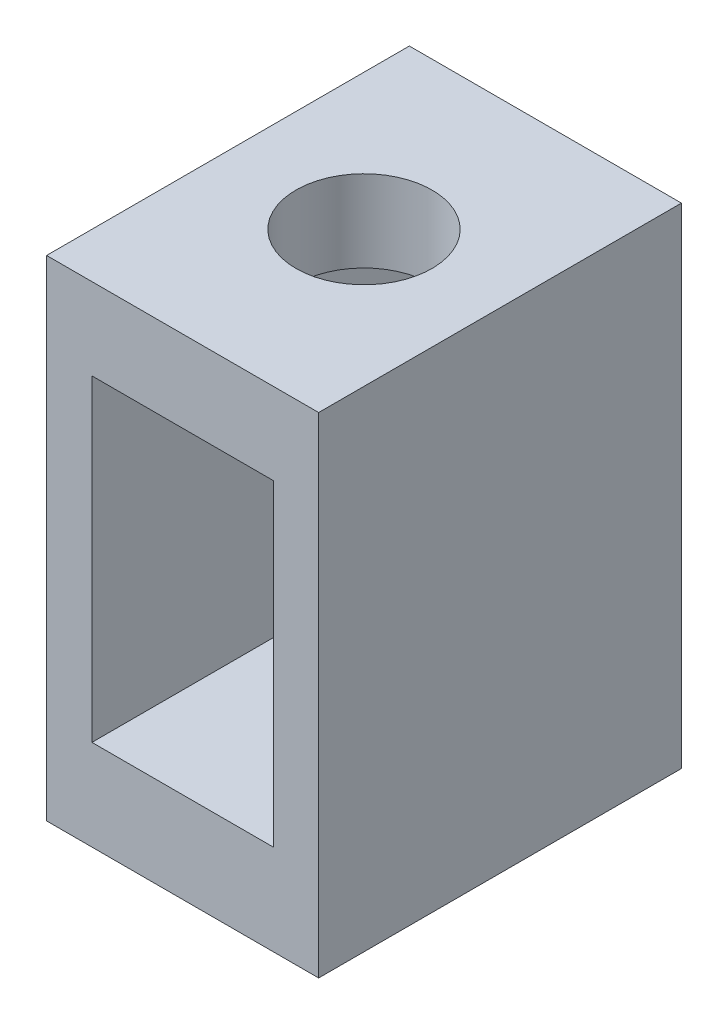
ISO-10303-21;
HEADER;
FILE_DESCRIPTION(('STEP AP214'),'2;1');
FILE_NAME('part.step','',(''),(''),'','','');
FILE_SCHEMA(('AUTOMOTIVE_DESIGN { 1 0 10303 214 1 1 1 1 }'));
ENDSEC;
DATA;
#1=APPLICATION_CONTEXT('core data for automotive mechanical design processes');
#2=APPLICATION_PROTOCOL_DEFINITION('international standard','automotive_design',2000,#1);
#3=PRODUCT_CONTEXT('',#1,'mechanical');
#4=PRODUCT('Part','Part','',(#3));
#5=PRODUCT_RELATED_PRODUCT_CATEGORY('part','',(#4));
#6=PRODUCT_DEFINITION_FORMATION('','',#4);
#7=PRODUCT_DEFINITION_CONTEXT('part definition',#1,'design');
#8=PRODUCT_DEFINITION('design','',#6,#7);
#9=PRODUCT_DEFINITION_SHAPE('','',#8);
#10=(LENGTH_UNIT() NAMED_UNIT(*) SI_UNIT(.MILLI.,.METRE.));
#11=(NAMED_UNIT(*) PLANE_ANGLE_UNIT() SI_UNIT($,.RADIAN.));
#12=(NAMED_UNIT(*) SI_UNIT($,.STERADIAN.) SOLID_ANGLE_UNIT());
#13=UNCERTAINTY_MEASURE_WITH_UNIT(LENGTH_MEASURE(1.E-05),#10,'distance_accuracy_value','');
#14=(GEOMETRIC_REPRESENTATION_CONTEXT(3) GLOBAL_UNCERTAINTY_ASSIGNED_CONTEXT((#13)) GLOBAL_UNIT_ASSIGNED_CONTEXT((#10,
#11,#12)) REPRESENTATION_CONTEXT('',''));
#15=CARTESIAN_POINT('',(0.,0.,0.));
#16=DIRECTION('',(0.,0.,1.));
#17=DIRECTION('',(1.,0.,0.));
#18=AXIS2_PLACEMENT_3D('',#15,#16,#17);
#19=CARTESIAN_POINT('',(1.5,2.7,-4.));
#20=DIRECTION('',(1.,0.,0.));
#21=DIRECTION('',(0.,1.,0.));
#22=AXIS2_PLACEMENT_3D('',#19,#20,#21);
#23=PLANE('',#22);
#24=DIRECTION('',(0.,1.,0.));
#25=VECTOR('',#24,1.);
#26=CARTESIAN_POINT('',(1.5,2.7,0.));
#27=LINE('',#26,#25);
#28=CARTESIAN_POINT('',(1.5,-2.7,0.));
#29=VERTEX_POINT('',#28);
#30=CARTESIAN_POINT('',(1.5,2.7,0.));
#31=VERTEX_POINT('',#30);
#32=EDGE_CURVE('E136',#29,#31,#27,.T.);
#33=ORIENTED_EDGE('',*,*,#32,.F.);
#34=DIRECTION('',(0.,0.,1.));
#35=VECTOR('',#34,1.);
#36=CARTESIAN_POINT('',(1.5,-2.7,-4.));
#37=LINE('',#36,#35);
#38=CARTESIAN_POINT('',(1.5,-2.7,-4.));
#39=VERTEX_POINT('',#38);
#40=EDGE_CURVE('E11',#39,#29,#37,.T.);
#41=ORIENTED_EDGE('',*,*,#40,.F.);
#42=DIRECTION('',(0.,1.,0.));
#43=VECTOR('',#42,1.);
#44=CARTESIAN_POINT('',(1.5,2.7,-4.));
#45=LINE('',#44,#43);
#46=CARTESIAN_POINT('',(1.5,2.7,-4.));
#47=VERTEX_POINT('',#46);
#48=EDGE_CURVE('E140',#39,#47,#45,.T.);
#49=ORIENTED_EDGE('',*,*,#48,.T.);
#50=DIRECTION('',(0.,0.,1.));
#51=VECTOR('',#50,1.);
#52=CARTESIAN_POINT('',(1.5,2.7,-4.));
#53=LINE('',#52,#51);
#54=EDGE_CURVE('E38',#47,#31,#53,.T.);
#55=ORIENTED_EDGE('',*,*,#54,.T.);
#56=EDGE_LOOP('',(#33,#41,#49,#55));
#57=FACE_BOUND('',#56,.T.);
#58=ADVANCED_FACE('F35',(#57),#23,.T.);
#59=CARTESIAN_POINT('',(-1.5,-2.7,-4.));
#60=DIRECTION('',(0.,-1.,0.));
#61=DIRECTION('',(0.,0.,-1.));
#62=AXIS2_PLACEMENT_3D('',#59,#60,#61);
#63=PLANE('',#62);
#64=DIRECTION('',(1.,0.,0.));
#65=VECTOR('',#64,1.);
#66=CARTESIAN_POINT('',(-1.5,-2.7,0.));
#67=LINE('',#66,#65);
#68=CARTESIAN_POINT('',(-1.5,-2.7,0.));
#69=VERTEX_POINT('',#68);
#70=EDGE_CURVE('E144',#69,#29,#67,.T.);
#71=ORIENTED_EDGE('',*,*,#70,.F.);
#72=DIRECTION('',(0.,0.,1.));
#73=VECTOR('',#72,1.);
#74=CARTESIAN_POINT('',(-1.5,-2.7,-4.));
#75=LINE('',#74,#73);
#76=CARTESIAN_POINT('',(-1.5,-2.7,-4.));
#77=VERTEX_POINT('',#76);
#78=EDGE_CURVE('E43',#77,#69,#75,.T.);
#79=ORIENTED_EDGE('',*,*,#78,.F.);
#80=DIRECTION('',(1.,0.,0.));
#81=VECTOR('',#80,1.);
#82=CARTESIAN_POINT('',(-1.5,-2.7,-4.));
#83=LINE('',#82,#81);
#84=EDGE_CURVE('E150',#77,#39,#83,.T.);
#85=ORIENTED_EDGE('',*,*,#84,.T.);
#86=ORIENTED_EDGE('',*,*,#40,.T.);
#87=EDGE_LOOP('',(#71,#79,#85,#86));
#88=FACE_BOUND('',#87,.T.);
#89=ADVANCED_FACE('F176',(#88),#63,.T.);
#90=CARTESIAN_POINT('',(-1.5,2.7,-4.));
#91=DIRECTION('',(-1.,0.,0.));
#92=DIRECTION('',(0.,-1.,0.));
#93=AXIS2_PLACEMENT_3D('',#90,#91,#92);
#94=PLANE('',#93);
#95=DIRECTION('',(0.,-1.,0.));
#96=VECTOR('',#95,1.);
#97=CARTESIAN_POINT('',(-1.5,2.7,0.));
#98=LINE('',#97,#96);
#99=CARTESIAN_POINT('',(-1.5,2.7,0.));
#100=VERTEX_POINT('',#99);
#101=EDGE_CURVE('E158',#100,#69,#98,.T.);
#102=ORIENTED_EDGE('',*,*,#101,.F.);
#103=DIRECTION('',(0.,0.,1.));
#104=VECTOR('',#103,1.);
#105=CARTESIAN_POINT('',(-1.5,2.7,-4.));
#106=LINE('',#105,#104);
#107=CARTESIAN_POINT('',(-1.5,2.7,-4.));
#108=VERTEX_POINT('',#107);
#109=EDGE_CURVE('E163',#108,#100,#106,.T.);
#110=ORIENTED_EDGE('',*,*,#109,.F.);
#111=DIRECTION('',(0.,-1.,0.));
#112=VECTOR('',#111,1.);
#113=CARTESIAN_POINT('',(-1.5,2.7,-4.));
#114=LINE('',#113,#112);
#115=EDGE_CURVE('E147',#108,#77,#114,.T.);
#116=ORIENTED_EDGE('',*,*,#115,.T.);
#117=ORIENTED_EDGE('',*,*,#78,.T.);
#118=EDGE_LOOP('',(#102,#110,#116,#117));
#119=FACE_BOUND('',#118,.T.);
#120=ADVANCED_FACE('F180',(#119),#94,.T.);
#121=CARTESIAN_POINT('',(-1.5,2.7,-4.));
#122=DIRECTION('',(0.,1.,0.));
#123=DIRECTION('',(0.,0.,1.));
#124=AXIS2_PLACEMENT_3D('',#121,#122,#123);
#125=PLANE('',#124);
#126=CARTESIAN_POINT('',(0.,2.7,-2.));
#127=DIRECTION('',(0.,1.,0.));
#128=DIRECTION('',(0.,0.,1.));
#129=AXIS2_PLACEMENT_3D('',#126,#127,#128);
#130=CIRCLE('',#129,0.75);
#131=CARTESIAN_POINT('',(0.,2.7,-1.25));
#132=VERTEX_POINT('',#131);
#133=EDGE_CURVE('E275',#132,#132,#130,.T.);
#134=ORIENTED_EDGE('',*,*,#133,.F.);
#135=EDGE_LOOP('',(#134));
#136=FACE_BOUND('',#135,.T.);
#137=DIRECTION('',(-1.,0.,0.));
#138=VECTOR('',#137,1.);
#139=CARTESIAN_POINT('',(-1.5,2.7,0.));
#140=LINE('',#139,#138);
#141=EDGE_CURVE('E155',#31,#100,#140,.T.);
#142=ORIENTED_EDGE('',*,*,#141,.F.);
#143=ORIENTED_EDGE('',*,*,#54,.F.);
#144=DIRECTION('',(-1.,0.,0.));
#145=VECTOR('',#144,1.);
#146=CARTESIAN_POINT('',(-1.5,2.7,-4.));
#147=LINE('',#146,#145);
#148=EDGE_CURVE('E143',#47,#108,#147,.T.);
#149=ORIENTED_EDGE('',*,*,#148,.T.);
#150=ORIENTED_EDGE('',*,*,#109,.T.);
#151=EDGE_LOOP('',(#142,#143,#149,#150));
#152=FACE_BOUND('',#151,.T.);
#153=ADVANCED_FACE('F171',(#136,#152),#125,.T.);
#154=CARTESIAN_POINT('',(0.,0.,-4.));
#155=DIRECTION('',(0.,0.,1.));
#156=DIRECTION('',(1.,0.,0.));
#157=AXIS2_PLACEMENT_3D('',#154,#155,#156);
#158=PLANE('',#157);
#159=DIRECTION('',(-1.,0.,0.));
#160=VECTOR('',#159,1.);
#161=CARTESIAN_POINT('',(-1.,1.8,-4.));
#162=LINE('',#161,#160);
#163=CARTESIAN_POINT('',(0.999999999999999,1.8,-4.));
#164=VERTEX_POINT('',#163);
#165=CARTESIAN_POINT('',(-1.,1.8,-4.));
#166=VERTEX_POINT('',#165);
#167=EDGE_CURVE('E108',#164,#166,#162,.T.);
#168=ORIENTED_EDGE('',*,*,#167,.T.);
#169=DIRECTION('',(0.,-1.,0.));
#170=VECTOR('',#169,1.);
#171=CARTESIAN_POINT('',(-1.,1.8,-4.));
#172=LINE('',#171,#170);
#173=CARTESIAN_POINT('',(-1.,-1.7,-4.));
#174=VERTEX_POINT('',#173);
#175=EDGE_CURVE('E102',#166,#174,#172,.T.);
#176=ORIENTED_EDGE('',*,*,#175,.T.);
#177=DIRECTION('',(1.,0.,0.));
#178=VECTOR('',#177,1.);
#179=CARTESIAN_POINT('',(-1.,-1.7,-4.));
#180=LINE('',#179,#178);
#181=CARTESIAN_POINT('',(0.999999999999998,-1.7,-4.));
#182=VERTEX_POINT('',#181);
#183=EDGE_CURVE('E111',#174,#182,#180,.T.);
#184=ORIENTED_EDGE('',*,*,#183,.T.);
#185=DIRECTION('',(0.,1.,0.));
#186=VECTOR('',#185,1.);
#187=CARTESIAN_POINT('',(0.999999999999999,1.8,-4.));
#188=LINE('',#187,#186);
#189=EDGE_CURVE('E51',#182,#164,#188,.T.);
#190=ORIENTED_EDGE('',*,*,#189,.T.);
#191=EDGE_LOOP('',(#168,#176,#184,#190));
#192=FACE_BOUND('',#191,.T.);
#193=ORIENTED_EDGE('',*,*,#48,.F.);
#194=ORIENTED_EDGE('',*,*,#84,.F.);
#195=ORIENTED_EDGE('',*,*,#115,.F.);
#196=ORIENTED_EDGE('',*,*,#148,.F.);
#197=EDGE_LOOP('',(#193,#194,#195,#196));
#198=FACE_BOUND('',#197,.T.);
#199=ADVANCED_FACE('F115',(#192,#198),#158,.F.);
#200=CARTESIAN_POINT('',(0.,0.,0.));
#201=DIRECTION('',(0.,0.,1.));
#202=DIRECTION('',(1.,0.,0.));
#203=AXIS2_PLACEMENT_3D('',#200,#201,#202);
#204=PLANE('',#203);
#205=DIRECTION('',(0.,-1.,0.));
#206=VECTOR('',#205,1.);
#207=CARTESIAN_POINT('',(-1.,1.8,0.));
#208=LINE('',#207,#206);
#209=CARTESIAN_POINT('',(-1.,1.8,0.));
#210=VERTEX_POINT('',#209);
#211=CARTESIAN_POINT('',(-1.,-1.7,0.));
#212=VERTEX_POINT('',#211);
#213=EDGE_CURVE('E59',#210,#212,#208,.T.);
#214=ORIENTED_EDGE('',*,*,#213,.F.);
#215=DIRECTION('',(-1.,0.,0.));
#216=VECTOR('',#215,1.);
#217=CARTESIAN_POINT('',(-1.,1.8,0.));
#218=LINE('',#217,#216);
#219=CARTESIAN_POINT('',(0.999999999999999,1.8,0.));
#220=VERTEX_POINT('',#219);
#221=EDGE_CURVE('E118',#220,#210,#218,.T.);
#222=ORIENTED_EDGE('',*,*,#221,.F.);
#223=DIRECTION('',(0.,1.,0.));
#224=VECTOR('',#223,1.);
#225=CARTESIAN_POINT('',(0.999999999999999,1.8,0.));
#226=LINE('',#225,#224);
#227=CARTESIAN_POINT('',(0.999999999999998,-1.7,0.));
#228=VERTEX_POINT('',#227);
#229=EDGE_CURVE('E121',#228,#220,#226,.T.);
#230=ORIENTED_EDGE('',*,*,#229,.F.);
#231=DIRECTION('',(1.,0.,0.));
#232=VECTOR('',#231,1.);
#233=CARTESIAN_POINT('',(-1.,-1.7,0.));
#234=LINE('',#233,#232);
#235=EDGE_CURVE('E130',#212,#228,#234,.T.);
#236=ORIENTED_EDGE('',*,*,#235,.F.);
#237=EDGE_LOOP('',(#214,#222,#230,#236));
#238=FACE_BOUND('',#237,.T.);
#239=ORIENTED_EDGE('',*,*,#32,.T.);
#240=ORIENTED_EDGE('',*,*,#141,.T.);
#241=ORIENTED_EDGE('',*,*,#101,.T.);
#242=ORIENTED_EDGE('',*,*,#70,.T.);
#243=EDGE_LOOP('',(#239,#240,#241,#242));
#244=FACE_BOUND('',#243,.T.);
#245=ADVANCED_FACE('F173',(#238,#244),#204,.T.);
#246=CARTESIAN_POINT('',(-1.,1.8,-4.));
#247=DIRECTION('',(-1.,0.,0.));
#248=DIRECTION('',(0.,-1.,0.));
#249=AXIS2_PLACEMENT_3D('',#246,#247,#248);
#250=PLANE('',#249);
#251=ORIENTED_EDGE('',*,*,#213,.T.);
#252=DIRECTION('',(0.,0.,1.));
#253=VECTOR('',#252,1.);
#254=CARTESIAN_POINT('',(-1.,-1.7,-4.));
#255=LINE('',#254,#253);
#256=EDGE_CURVE('E98',#174,#212,#255,.T.);
#257=ORIENTED_EDGE('',*,*,#256,.F.);
#258=ORIENTED_EDGE('',*,*,#175,.F.);
#259=DIRECTION('',(0.,0.,1.));
#260=VECTOR('',#259,1.);
#261=CARTESIAN_POINT('',(-1.,1.8,-4.));
#262=LINE('',#261,#260);
#263=EDGE_CURVE('E134',#166,#210,#262,.T.);
#264=ORIENTED_EDGE('',*,*,#263,.T.);
#265=EDGE_LOOP('',(#251,#257,#258,#264));
#266=FACE_BOUND('',#265,.T.);
#267=ADVANCED_FACE('F100',(#266),#250,.F.);
#268=CARTESIAN_POINT('',(-1.,1.8,-4.));
#269=DIRECTION('',(0.,1.,0.));
#270=DIRECTION('',(0.,0.,1.));
#271=AXIS2_PLACEMENT_3D('',#268,#269,#270);
#272=PLANE('',#271);
#273=CARTESIAN_POINT('',(0.,1.8,-2.));
#274=DIRECTION('',(0.,1.,0.));
#275=DIRECTION('',(0.,0.,1.));
#276=AXIS2_PLACEMENT_3D('',#273,#274,#275);
#277=CIRCLE('',#276,0.75);
#278=CARTESIAN_POINT('',(0.,1.8,-1.25));
#279=VERTEX_POINT('',#278);
#280=EDGE_CURVE('E124',#279,#279,#277,.F.);
#281=ORIENTED_EDGE('',*,*,#280,.F.);
#282=EDGE_LOOP('',(#281));
#283=FACE_BOUND('',#282,.T.);
#284=ORIENTED_EDGE('',*,*,#221,.T.);
#285=ORIENTED_EDGE('',*,*,#263,.F.);
#286=ORIENTED_EDGE('',*,*,#167,.F.);
#287=DIRECTION('',(0.,0.,1.));
#288=VECTOR('',#287,1.);
#289=CARTESIAN_POINT('',(0.999999999999999,1.8,-4.));
#290=LINE('',#289,#288);
#291=EDGE_CURVE('E137',#164,#220,#290,.T.);
#292=ORIENTED_EDGE('',*,*,#291,.T.);
#293=EDGE_LOOP('',(#284,#285,#286,#292));
#294=FACE_BOUND('',#293,.T.);
#295=ADVANCED_FACE('F227',(#283,#294),#272,.F.);
#296=CARTESIAN_POINT('',(0.999999999999999,1.8,-4.));
#297=DIRECTION('',(1.,0.,0.));
#298=DIRECTION('',(0.,1.,0.));
#299=AXIS2_PLACEMENT_3D('',#296,#297,#298);
#300=PLANE('',#299);
#301=ORIENTED_EDGE('',*,*,#229,.T.);
#302=ORIENTED_EDGE('',*,*,#291,.F.);
#303=ORIENTED_EDGE('',*,*,#189,.F.);
#304=DIRECTION('',(0.,0.,1.));
#305=VECTOR('',#304,1.);
#306=CARTESIAN_POINT('',(0.999999999999998,-1.7,-4.));
#307=LINE('',#306,#305);
#308=EDGE_CURVE('E107',#182,#228,#307,.T.);
#309=ORIENTED_EDGE('',*,*,#308,.T.);
#310=EDGE_LOOP('',(#301,#302,#303,#309));
#311=FACE_BOUND('',#310,.T.);
#312=ADVANCED_FACE('F234',(#311),#300,.F.);
#313=CARTESIAN_POINT('',(-1.,-1.7,-4.));
#314=DIRECTION('',(0.,-1.,0.));
#315=DIRECTION('',(0.,0.,-1.));
#316=AXIS2_PLACEMENT_3D('',#313,#314,#315);
#317=PLANE('',#316);
#318=ORIENTED_EDGE('',*,*,#235,.T.);
#319=ORIENTED_EDGE('',*,*,#308,.F.);
#320=ORIENTED_EDGE('',*,*,#183,.F.);
#321=ORIENTED_EDGE('',*,*,#256,.T.);
#322=EDGE_LOOP('',(#318,#319,#320,#321));
#323=FACE_BOUND('',#322,.T.);
#324=ADVANCED_FACE('F112',(#323),#317,.F.);
#325=CARTESIAN_POINT('',(0.,-2.701,-2.));
#326=DIRECTION('',(0.,1.,0.));
#327=DIRECTION('',(0.,0.,1.));
#328=AXIS2_PLACEMENT_3D('',#325,#326,#327);
#329=CYLINDRICAL_SURFACE('',#328,0.75);
#330=ORIENTED_EDGE('',*,*,#133,.T.);
#331=EDGE_LOOP('',(#330));
#332=FACE_BOUND('',#331,.T.);
#333=ORIENTED_EDGE('',*,*,#280,.T.);
#334=EDGE_LOOP('',(#333));
#335=FACE_BOUND('',#334,.T.);
#336=ADVANCED_FACE('F247',(#332,#335),#329,.F.);
#337=CLOSED_SHELL('',(#58,#89,#120,#153,#199,#245,#267,#295,#312,#324,#336));
#338=MANIFOLD_SOLID_BREP('B2',#337);
#339=ADVANCED_BREP_SHAPE_REPRESENTATION('',(#18,#338),#14);
#340=SHAPE_DEFINITION_REPRESENTATION(#9,#339);
ENDSEC;
END-ISO-10303-21;
